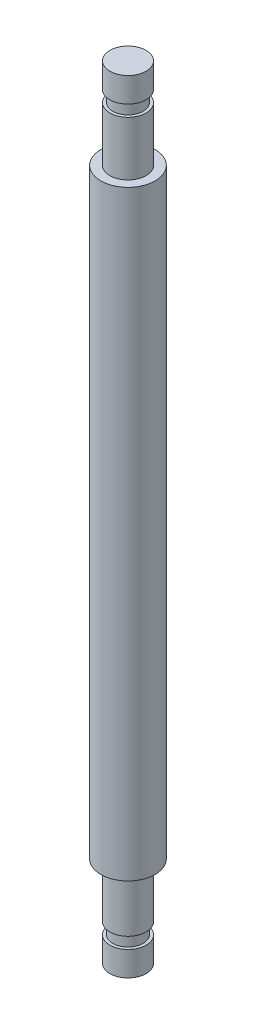
ISO-10303-21;
HEADER;
FILE_DESCRIPTION(('STEP AP214'),'2;1');
FILE_NAME('part.step','',(''),(''),'','','');
FILE_SCHEMA(('AUTOMOTIVE_DESIGN { 1 0 10303 214 1 1 1 1 }'));
ENDSEC;
DATA;
#1=APPLICATION_CONTEXT('core data for automotive mechanical design processes');
#2=APPLICATION_PROTOCOL_DEFINITION('international standard','automotive_design',2000,#1);
#3=PRODUCT_CONTEXT('',#1,'mechanical');
#4=PRODUCT('Part','Part','',(#3));
#5=PRODUCT_RELATED_PRODUCT_CATEGORY('part','',(#4));
#6=PRODUCT_DEFINITION_FORMATION('','',#4);
#7=PRODUCT_DEFINITION_CONTEXT('part definition',#1,'design');
#8=PRODUCT_DEFINITION('design','',#6,#7);
#9=PRODUCT_DEFINITION_SHAPE('','',#8);
#10=(LENGTH_UNIT() NAMED_UNIT(*) SI_UNIT(.MILLI.,.METRE.));
#11=(NAMED_UNIT(*) PLANE_ANGLE_UNIT() SI_UNIT($,.RADIAN.));
#12=(NAMED_UNIT(*) SI_UNIT($,.STERADIAN.) SOLID_ANGLE_UNIT());
#13=UNCERTAINTY_MEASURE_WITH_UNIT(LENGTH_MEASURE(1.E-05),#10,'distance_accuracy_value','');
#14=(GEOMETRIC_REPRESENTATION_CONTEXT(3) GLOBAL_UNCERTAINTY_ASSIGNED_CONTEXT((#13)) GLOBAL_UNIT_ASSIGNED_CONTEXT((#10,
#11,#12)) REPRESENTATION_CONTEXT('',''));
#15=CARTESIAN_POINT('',(0.,0.,0.));
#16=DIRECTION('',(0.,0.,1.));
#17=DIRECTION('',(1.,0.,0.));
#18=AXIS2_PLACEMENT_3D('',#15,#16,#17);
#19=CARTESIAN_POINT('',(0.,137.2,0.));
#20=DIRECTION('',(0.,-1.,0.));
#21=DIRECTION('',(0.,0.,-1.));
#22=AXIS2_PLACEMENT_3D('',#19,#20,#21);
#23=CYLINDRICAL_SURFACE('',#22,3.175);
#24=CARTESIAN_POINT('',(0.,15.87,0.));
#25=DIRECTION('',(0.,1.,0.));
#26=DIRECTION('',(0.,0.,1.));
#27=AXIS2_PLACEMENT_3D('',#24,#25,#26);
#28=CIRCLE('',#27,3.175);
#29=CARTESIAN_POINT('',(0.,15.87,3.175));
#30=VERTEX_POINT('',#29);
#31=EDGE_CURVE('E10',#30,#30,#28,.T.);
#32=ORIENTED_EDGE('',*,*,#31,.F.);
#33=EDGE_LOOP('',(#32));
#34=FACE_BOUND('',#33,.T.);
#35=CARTESIAN_POINT('',(0.,6.34,0.));
#36=DIRECTION('',(0.,1.,0.));
#37=DIRECTION('',(0.,0.,1.));
#38=AXIS2_PLACEMENT_3D('',#35,#36,#37);
#39=CIRCLE('',#38,3.175);
#40=CARTESIAN_POINT('',(0.,6.34,3.175));
#41=VERTEX_POINT('',#40);
#42=EDGE_CURVE('E74',#41,#41,#39,.T.);
#43=ORIENTED_EDGE('',*,*,#42,.T.);
#44=EDGE_LOOP('',(#43));
#45=FACE_BOUND('',#44,.T.);
#46=ADVANCED_FACE('F31',(#34,#45),#23,.T.);
#47=CARTESIAN_POINT('',(0.,121.32,0.));
#48=DIRECTION('',(0.,1.,0.));
#49=DIRECTION('',(0.,0.,1.));
#50=AXIS2_PLACEMENT_3D('',#47,#48,#49);
#51=CIRCLE('',#50,3.175);
#52=CARTESIAN_POINT('',(0.,121.32,3.175));
#53=VERTEX_POINT('',#52);
#54=EDGE_CURVE('E47',#53,#53,#51,.T.);
#55=ORIENTED_EDGE('',*,*,#54,.T.);
#56=EDGE_LOOP('',(#55));
#57=FACE_BOUND('',#56,.T.);
#58=CARTESIAN_POINT('',(0.,130.85,0.));
#59=DIRECTION('',(0.,1.,0.));
#60=DIRECTION('',(0.,0.,1.));
#61=AXIS2_PLACEMENT_3D('',#58,#59,#60);
#62=CIRCLE('',#61,3.175);
#63=CARTESIAN_POINT('',(0.,130.85,3.175));
#64=VERTEX_POINT('',#63);
#65=EDGE_CURVE('E62',#64,#64,#62,.T.);
#66=ORIENTED_EDGE('',*,*,#65,.F.);
#67=EDGE_LOOP('',(#66));
#68=FACE_BOUND('',#67,.T.);
#69=ADVANCED_FACE('F100',(#57,#68),#23,.T.);
#70=CARTESIAN_POINT('',(0.,15.87,0.));
#71=DIRECTION('',(0.,1.,0.));
#72=DIRECTION('',(0.,0.,1.));
#73=AXIS2_PLACEMENT_3D('',#70,#71,#72);
#74=CYLINDRICAL_SURFACE('',#73,4.7625);
#75=CARTESIAN_POINT('',(0.,15.87,0.));
#76=DIRECTION('',(0.,1.,0.));
#77=DIRECTION('',(0.,0.,1.));
#78=AXIS2_PLACEMENT_3D('',#75,#76,#77);
#79=CIRCLE('',#78,4.7625);
#80=CARTESIAN_POINT('',(0.,15.87,4.7625));
#81=VERTEX_POINT('',#80);
#82=EDGE_CURVE('E53',#81,#81,#79,.T.);
#83=ORIENTED_EDGE('',*,*,#82,.T.);
#84=EDGE_LOOP('',(#83));
#85=FACE_BOUND('',#84,.T.);
#86=CARTESIAN_POINT('',(0.,121.32,0.));
#87=DIRECTION('',(0.,1.,0.));
#88=DIRECTION('',(0.,0.,1.));
#89=AXIS2_PLACEMENT_3D('',#86,#87,#88);
#90=CIRCLE('',#89,4.7625);
#91=CARTESIAN_POINT('',(0.,121.32,4.7625));
#92=VERTEX_POINT('',#91);
#93=EDGE_CURVE('E50',#92,#92,#90,.T.);
#94=ORIENTED_EDGE('',*,*,#93,.F.);
#95=EDGE_LOOP('',(#94));
#96=FACE_BOUND('',#95,.T.);
#97=ADVANCED_FACE('F118',(#85,#96),#74,.T.);
#98=CARTESIAN_POINT('',(0.,15.87,0.));
#99=DIRECTION('',(0.,1.,0.));
#100=DIRECTION('',(0.,0.,1.));
#101=AXIS2_PLACEMENT_3D('',#98,#99,#100);
#102=PLANE('',#101);
#103=ORIENTED_EDGE('',*,*,#31,.T.);
#104=EDGE_LOOP('',(#103));
#105=FACE_BOUND('',#104,.T.);
#106=ORIENTED_EDGE('',*,*,#82,.F.);
#107=EDGE_LOOP('',(#106));
#108=FACE_BOUND('',#107,.T.);
#109=ADVANCED_FACE('F148',(#105,#108),#102,.F.);
#110=CARTESIAN_POINT('',(0.,121.32,0.));
#111=DIRECTION('',(0.,1.,0.));
#112=DIRECTION('',(0.,0.,1.));
#113=AXIS2_PLACEMENT_3D('',#110,#111,#112);
#114=PLANE('',#113);
#115=ORIENTED_EDGE('',*,*,#54,.F.);
#116=EDGE_LOOP('',(#115));
#117=FACE_BOUND('',#116,.T.);
#118=ORIENTED_EDGE('',*,*,#93,.T.);
#119=EDGE_LOOP('',(#118));
#120=FACE_BOUND('',#119,.T.);
#121=ADVANCED_FACE('F133',(#117,#120),#114,.T.);
#122=CARTESIAN_POINT('',(0.,132.85,0.));
#123=DIRECTION('',(0.,1.,0.));
#124=DIRECTION('',(0.,0.,1.));
#125=AXIS2_PLACEMENT_3D('',#122,#123,#124);
#126=PLANE('',#125);
#127=CARTESIAN_POINT('',(0.,132.85,0.));
#128=DIRECTION('',(0.,1.,0.));
#129=DIRECTION('',(0.,0.,1.));
#130=AXIS2_PLACEMENT_3D('',#127,#128,#129);
#131=CIRCLE('',#130,3.175);
#132=CARTESIAN_POINT('',(0.,132.85,3.175));
#133=VERTEX_POINT('',#132);
#134=EDGE_CURVE('E60',#133,#133,#131,.T.);
#135=ORIENTED_EDGE('',*,*,#134,.F.);
#136=EDGE_LOOP('',(#135));
#137=FACE_BOUND('',#136,.T.);
#138=CARTESIAN_POINT('',(0.,132.85,0.));
#139=DIRECTION('',(0.,1.,0.));
#140=DIRECTION('',(0.,0.,1.));
#141=AXIS2_PLACEMENT_3D('',#138,#139,#140);
#142=CIRCLE('',#141,2.665);
#143=CARTESIAN_POINT('',(0.,132.85,2.665));
#144=VERTEX_POINT('',#143);
#145=EDGE_CURVE('E65',#144,#144,#142,.T.);
#146=ORIENTED_EDGE('',*,*,#145,.T.);
#147=EDGE_LOOP('',(#146));
#148=FACE_BOUND('',#147,.T.);
#149=ADVANCED_FACE('F129',(#137,#148),#126,.F.);
#150=CARTESIAN_POINT('',(0.,130.85,0.));
#151=DIRECTION('',(0.,1.,0.));
#152=DIRECTION('',(0.,0.,1.));
#153=AXIS2_PLACEMENT_3D('',#150,#151,#152);
#154=PLANE('',#153);
#155=ORIENTED_EDGE('',*,*,#65,.T.);
#156=EDGE_LOOP('',(#155));
#157=FACE_BOUND('',#156,.T.);
#158=CARTESIAN_POINT('',(0.,130.85,0.));
#159=DIRECTION('',(0.,1.,0.));
#160=DIRECTION('',(0.,0.,1.));
#161=AXIS2_PLACEMENT_3D('',#158,#159,#160);
#162=CIRCLE('',#161,2.665);
#163=CARTESIAN_POINT('',(0.,130.85,2.665));
#164=VERTEX_POINT('',#163);
#165=EDGE_CURVE('E68',#164,#164,#162,.T.);
#166=ORIENTED_EDGE('',*,*,#165,.F.);
#167=EDGE_LOOP('',(#166));
#168=FACE_BOUND('',#167,.T.);
#169=ADVANCED_FACE('F132',(#157,#168),#154,.T.);
#170=CARTESIAN_POINT('',(0.,132.85,0.));
#171=DIRECTION('',(0.,-1.,0.));
#172=DIRECTION('',(0.,0.,-1.));
#173=AXIS2_PLACEMENT_3D('',#170,#171,#172);
#174=CYLINDRICAL_SURFACE('',#173,2.665);
#175=ORIENTED_EDGE('',*,*,#145,.F.);
#176=EDGE_LOOP('',(#175));
#177=FACE_BOUND('',#176,.T.);
#178=ORIENTED_EDGE('',*,*,#165,.T.);
#179=EDGE_LOOP('',(#178));
#180=FACE_BOUND('',#179,.T.);
#181=ADVANCED_FACE('F125',(#177,#180),#174,.T.);
#182=CARTESIAN_POINT('',(0.,137.2,0.));
#183=DIRECTION('',(0.,1.,0.));
#184=DIRECTION('',(0.,0.,1.));
#185=AXIS2_PLACEMENT_3D('',#182,#183,#184);
#186=PLANE('',#185);
#187=CARTESIAN_POINT('',(0.,137.2,0.));
#188=DIRECTION('',(0.,1.,0.));
#189=DIRECTION('',(0.,0.,1.));
#190=AXIS2_PLACEMENT_3D('',#187,#188,#189);
#191=CIRCLE('',#190,3.175);
#192=CARTESIAN_POINT('',(0.,137.2,3.175));
#193=VERTEX_POINT('',#192);
#194=EDGE_CURVE('E38',#193,#193,#191,.T.);
#195=ORIENTED_EDGE('',*,*,#194,.T.);
#196=EDGE_LOOP('',(#195));
#197=FACE_BOUND('',#196,.T.);
#198=ADVANCED_FACE('F120',(#197),#186,.T.);
#199=ORIENTED_EDGE('',*,*,#134,.T.);
#200=EDGE_LOOP('',(#199));
#201=FACE_BOUND('',#200,.T.);
#202=ORIENTED_EDGE('',*,*,#194,.F.);
#203=EDGE_LOOP('',(#202));
#204=FACE_BOUND('',#203,.T.);
#205=ADVANCED_FACE('F33',(#201,#204),#23,.T.);
#206=CARTESIAN_POINT('',(0.,4.34,0.));
#207=DIRECTION('',(0.,-1.,0.));
#208=DIRECTION('',(0.,0.,1.));
#209=AXIS2_PLACEMENT_3D('',#206,#207,#208);
#210=PLANE('',#209);
#211=CARTESIAN_POINT('',(0.,4.34,0.));
#212=DIRECTION('',(0.,1.,0.));
#213=DIRECTION('',(0.,0.,1.));
#214=AXIS2_PLACEMENT_3D('',#211,#212,#213);
#215=CIRCLE('',#214,2.665);
#216=CARTESIAN_POINT('',(0.,4.34,2.665));
#217=VERTEX_POINT('',#216);
#218=EDGE_CURVE('E77',#217,#217,#215,.T.);
#219=ORIENTED_EDGE('',*,*,#218,.F.);
#220=EDGE_LOOP('',(#219));
#221=FACE_BOUND('',#220,.T.);
#222=CARTESIAN_POINT('',(0.,4.34,0.));
#223=DIRECTION('',(0.,1.,0.));
#224=DIRECTION('',(0.,0.,1.));
#225=AXIS2_PLACEMENT_3D('',#222,#223,#224);
#226=CIRCLE('',#225,3.175);
#227=CARTESIAN_POINT('',(0.,4.34,3.175));
#228=VERTEX_POINT('',#227);
#229=EDGE_CURVE('E71',#228,#228,#226,.T.);
#230=ORIENTED_EDGE('',*,*,#229,.T.);
#231=EDGE_LOOP('',(#230));
#232=FACE_BOUND('',#231,.T.);
#233=ADVANCED_FACE('F89',(#221,#232),#210,.F.);
#234=CARTESIAN_POINT('',(0.,6.34,0.));
#235=DIRECTION('',(0.,-1.,0.));
#236=DIRECTION('',(0.,0.,1.));
#237=AXIS2_PLACEMENT_3D('',#234,#235,#236);
#238=PLANE('',#237);
#239=CARTESIAN_POINT('',(0.,6.34,0.));
#240=DIRECTION('',(0.,1.,0.));
#241=DIRECTION('',(0.,0.,1.));
#242=AXIS2_PLACEMENT_3D('',#239,#240,#241);
#243=CIRCLE('',#242,2.665);
#244=CARTESIAN_POINT('',(0.,6.34,2.665));
#245=VERTEX_POINT('',#244);
#246=EDGE_CURVE('E80',#245,#245,#243,.T.);
#247=ORIENTED_EDGE('',*,*,#246,.T.);
#248=EDGE_LOOP('',(#247));
#249=FACE_BOUND('',#248,.T.);
#250=ORIENTED_EDGE('',*,*,#42,.F.);
#251=EDGE_LOOP('',(#250));
#252=FACE_BOUND('',#251,.T.);
#253=ADVANCED_FACE('F92',(#249,#252),#238,.T.);
#254=CARTESIAN_POINT('',(0.,4.34,0.));
#255=DIRECTION('',(0.,1.,0.));
#256=DIRECTION('',(0.,0.,1.));
#257=AXIS2_PLACEMENT_3D('',#254,#255,#256);
#258=CYLINDRICAL_SURFACE('',#257,2.665);
#259=ORIENTED_EDGE('',*,*,#218,.T.);
#260=EDGE_LOOP('',(#259));
#261=FACE_BOUND('',#260,.T.);
#262=ORIENTED_EDGE('',*,*,#246,.F.);
#263=EDGE_LOOP('',(#262));
#264=FACE_BOUND('',#263,.T.);
#265=ADVANCED_FACE('F86',(#261,#264),#258,.T.);
#266=CARTESIAN_POINT('',(0.,0.,0.));
#267=DIRECTION('',(0.,1.,0.));
#268=DIRECTION('',(0.,0.,1.));
#269=AXIS2_PLACEMENT_3D('',#266,#267,#268);
#270=PLANE('',#269);
#271=CARTESIAN_POINT('',(0.,0.,0.));
#272=DIRECTION('',(0.,1.,0.));
#273=DIRECTION('',(0.,0.,1.));
#274=AXIS2_PLACEMENT_3D('',#271,#272,#273);
#275=CIRCLE('',#274,3.175);
#276=CARTESIAN_POINT('',(0.,0.,3.175));
#277=VERTEX_POINT('',#276);
#278=EDGE_CURVE('E42',#277,#277,#275,.T.);
#279=ORIENTED_EDGE('',*,*,#278,.F.);
#280=EDGE_LOOP('',(#279));
#281=FACE_BOUND('',#280,.T.);
#282=ADVANCED_FACE('F99',(#281),#270,.F.);
#283=ORIENTED_EDGE('',*,*,#229,.F.);
#284=EDGE_LOOP('',(#283));
#285=FACE_BOUND('',#284,.T.);
#286=ORIENTED_EDGE('',*,*,#278,.T.);
#287=EDGE_LOOP('',(#286));
#288=FACE_BOUND('',#287,.T.);
#289=ADVANCED_FACE('F96',(#285,#288),#23,.T.);
#290=CLOSED_SHELL('',(#46,#69,#97,#109,#121,#149,#169,#181,#198,#205,#233,#253,#265,#282,#289));
#291=MANIFOLD_SOLID_BREP('B2',#290);
#292=ADVANCED_BREP_SHAPE_REPRESENTATION('',(#18,#291),#14);
#293=SHAPE_DEFINITION_REPRESENTATION(#9,#292);
ENDSEC;
END-ISO-10303-21;
